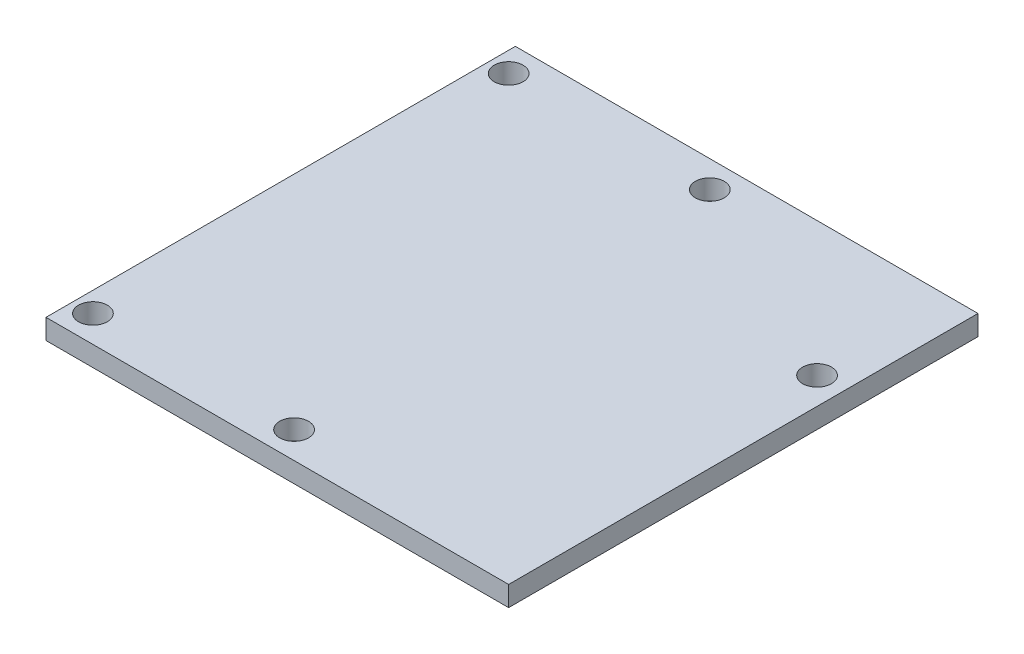
ISO-10303-21;
HEADER;
FILE_DESCRIPTION(('STEP AP214'),'2;1');
FILE_NAME('part.step','',(''),(''),'','','');
FILE_SCHEMA(('AUTOMOTIVE_DESIGN { 1 0 10303 214 1 1 1 1 }'));
ENDSEC;
DATA;
#1=APPLICATION_CONTEXT('core data for automotive mechanical design processes');
#2=APPLICATION_PROTOCOL_DEFINITION('international standard','automotive_design',2000,#1);
#3=PRODUCT_CONTEXT('',#1,'mechanical');
#4=PRODUCT('Part','Part','',(#3));
#5=PRODUCT_RELATED_PRODUCT_CATEGORY('part','',(#4));
#6=PRODUCT_DEFINITION_FORMATION('','',#4);
#7=PRODUCT_DEFINITION_CONTEXT('part definition',#1,'design');
#8=PRODUCT_DEFINITION('design','',#6,#7);
#9=PRODUCT_DEFINITION_SHAPE('','',#8);
#10=(LENGTH_UNIT() NAMED_UNIT(*) SI_UNIT(.MILLI.,.METRE.));
#11=(NAMED_UNIT(*) PLANE_ANGLE_UNIT() SI_UNIT($,.RADIAN.));
#12=(NAMED_UNIT(*) SI_UNIT($,.STERADIAN.) SOLID_ANGLE_UNIT());
#13=UNCERTAINTY_MEASURE_WITH_UNIT(LENGTH_MEASURE(1.E-05),#10,'distance_accuracy_value','');
#14=(GEOMETRIC_REPRESENTATION_CONTEXT(3) GLOBAL_UNCERTAINTY_ASSIGNED_CONTEXT((#13)) GLOBAL_UNIT_ASSIGNED_CONTEXT((#10,
#11,#12)) REPRESENTATION_CONTEXT('',''));
#15=CARTESIAN_POINT('',(0.,0.,0.));
#16=DIRECTION('',(0.,0.,1.));
#17=DIRECTION('',(1.,0.,0.));
#18=AXIS2_PLACEMENT_3D('',#15,#16,#17);
#19=CARTESIAN_POINT('',(0.,3.,0.));
#20=DIRECTION('',(0.,-1.,0.));
#21=DIRECTION('',(0.,0.,-1.));
#22=AXIS2_PLACEMENT_3D('',#19,#20,#21);
#23=PLANE('',#22);
#24=DIRECTION('',(-1.,0.,0.));
#25=VECTOR('',#24,1.);
#26=CARTESIAN_POINT('',(-18.,3.,-35.));
#27=LINE('',#26,#25);
#28=CARTESIAN_POINT('',(51.,3.,-35.));
#29=VERTEX_POINT('',#28);
#30=CARTESIAN_POINT('',(-18.,3.,-35.));
#31=VERTEX_POINT('',#30);
#32=EDGE_CURVE('E57',#29,#31,#27,.T.);
#33=ORIENTED_EDGE('',*,*,#32,.T.);
#34=DIRECTION('',(0.,0.,1.));
#35=VECTOR('',#34,1.);
#36=CARTESIAN_POINT('',(-18.,3.,35.));
#37=LINE('',#36,#35);
#38=CARTESIAN_POINT('',(-18.,3.,35.));
#39=VERTEX_POINT('',#38);
#40=EDGE_CURVE('E87',#31,#39,#37,.T.);
#41=ORIENTED_EDGE('',*,*,#40,.T.);
#42=DIRECTION('',(1.,0.,0.));
#43=VECTOR('',#42,1.);
#44=CARTESIAN_POINT('',(-18.,3.,35.));
#45=LINE('',#44,#43);
#46=CARTESIAN_POINT('',(51.,3.,35.));
#47=VERTEX_POINT('',#46);
#48=EDGE_CURVE('E91',#39,#47,#45,.T.);
#49=ORIENTED_EDGE('',*,*,#48,.T.);
#50=DIRECTION('',(0.,0.,-1.));
#51=VECTOR('',#50,1.);
#52=CARTESIAN_POINT('',(51.,3.,-35.));
#53=LINE('',#52,#51);
#54=EDGE_CURVE('E102',#47,#29,#53,.T.);
#55=ORIENTED_EDGE('',*,*,#54,.T.);
#56=EDGE_LOOP('',(#33,#41,#49,#55));
#57=FACE_BOUND('',#56,.T.);
#58=CARTESIAN_POINT('',(15.,3.,-31.));
#59=DIRECTION('',(0.,1.,0.));
#60=DIRECTION('',(0.,0.,1.));
#61=AXIS2_PLACEMENT_3D('',#58,#59,#60);
#62=CIRCLE('',#61,2.15);
#63=CARTESIAN_POINT('',(15.,3.,-28.85));
#64=VERTEX_POINT('',#63);
#65=EDGE_CURVE('E111',#64,#64,#62,.T.);
#66=ORIENTED_EDGE('',*,*,#65,.F.);
#67=EDGE_LOOP('',(#66));
#68=FACE_BOUND('',#67,.T.);
#69=CARTESIAN_POINT('',(-15.,3.,-31.));
#70=DIRECTION('',(0.,1.,0.));
#71=DIRECTION('',(0.,0.,1.));
#72=AXIS2_PLACEMENT_3D('',#69,#70,#71);
#73=CIRCLE('',#72,2.15);
#74=CARTESIAN_POINT('',(-15.,3.,-28.85));
#75=VERTEX_POINT('',#74);
#76=EDGE_CURVE('E193',#75,#75,#73,.T.);
#77=ORIENTED_EDGE('',*,*,#76,.F.);
#78=EDGE_LOOP('',(#77));
#79=FACE_BOUND('',#78,.T.);
#80=CARTESIAN_POINT('',(-15.,3.,31.));
#81=DIRECTION('',(0.,1.,0.));
#82=DIRECTION('',(0.,0.,1.));
#83=AXIS2_PLACEMENT_3D('',#80,#81,#82);
#84=CIRCLE('',#83,2.15);
#85=CARTESIAN_POINT('',(-15.,3.,33.15));
#86=VERTEX_POINT('',#85);
#87=EDGE_CURVE('E185',#86,#86,#84,.T.);
#88=ORIENTED_EDGE('',*,*,#87,.F.);
#89=EDGE_LOOP('',(#88));
#90=FACE_BOUND('',#89,.T.);
#91=CARTESIAN_POINT('',(15.,3.,31.));
#92=DIRECTION('',(0.,1.,0.));
#93=DIRECTION('',(0.,0.,1.));
#94=AXIS2_PLACEMENT_3D('',#91,#92,#93);
#95=CIRCLE('',#94,2.15);
#96=CARTESIAN_POINT('',(15.,3.,33.15));
#97=VERTEX_POINT('',#96);
#98=EDGE_CURVE('E177',#97,#97,#95,.T.);
#99=ORIENTED_EDGE('',*,*,#98,.F.);
#100=EDGE_LOOP('',(#99));
#101=FACE_BOUND('',#100,.T.);
#102=CARTESIAN_POINT('',(47.,3.,-15.));
#103=DIRECTION('',(0.,1.,0.));
#104=DIRECTION('',(0.,0.,1.));
#105=AXIS2_PLACEMENT_3D('',#102,#103,#104);
#106=CIRCLE('',#105,2.15);
#107=CARTESIAN_POINT('',(47.,3.,-12.85));
#108=VERTEX_POINT('',#107);
#109=EDGE_CURVE('E166',#108,#108,#106,.T.);
#110=ORIENTED_EDGE('',*,*,#109,.F.);
#111=EDGE_LOOP('',(#110));
#112=FACE_BOUND('',#111,.T.);
#113=ADVANCED_FACE('F39',(#57,#68,#79,#90,#101,#112),#23,.F.);
#114=CARTESIAN_POINT('',(0.,0.,0.));
#115=DIRECTION('',(0.,-1.,0.));
#116=DIRECTION('',(0.,0.,-1.));
#117=AXIS2_PLACEMENT_3D('',#114,#115,#116);
#118=PLANE('',#117);
#119=CARTESIAN_POINT('',(15.,0.,31.));
#120=DIRECTION('',(0.,1.,0.));
#121=DIRECTION('',(0.,0.,1.));
#122=AXIS2_PLACEMENT_3D('',#119,#120,#121);
#123=CIRCLE('',#122,2.15);
#124=CARTESIAN_POINT('',(15.,0.,33.15));
#125=VERTEX_POINT('',#124);
#126=EDGE_CURVE('E174',#125,#125,#123,.T.);
#127=ORIENTED_EDGE('',*,*,#126,.T.);
#128=EDGE_LOOP('',(#127));
#129=FACE_BOUND('',#128,.T.);
#130=CARTESIAN_POINT('',(-15.,0.,-31.));
#131=DIRECTION('',(0.,1.,0.));
#132=DIRECTION('',(0.,0.,1.));
#133=AXIS2_PLACEMENT_3D('',#130,#131,#132);
#134=CIRCLE('',#133,2.15);
#135=CARTESIAN_POINT('',(-15.,0.,-28.85));
#136=VERTEX_POINT('',#135);
#137=EDGE_CURVE('E189',#136,#136,#134,.T.);
#138=ORIENTED_EDGE('',*,*,#137,.T.);
#139=EDGE_LOOP('',(#138));
#140=FACE_BOUND('',#139,.T.);
#141=DIRECTION('',(0.,0.,1.));
#142=VECTOR('',#141,1.);
#143=CARTESIAN_POINT('',(-18.,0.,35.));
#144=LINE('',#143,#142);
#145=CARTESIAN_POINT('',(-18.,0.,-35.));
#146=VERTEX_POINT('',#145);
#147=CARTESIAN_POINT('',(-18.,0.,35.));
#148=VERTEX_POINT('',#147);
#149=EDGE_CURVE('E96',#146,#148,#144,.T.);
#150=ORIENTED_EDGE('',*,*,#149,.F.);
#151=DIRECTION('',(-1.,0.,0.));
#152=VECTOR('',#151,1.);
#153=CARTESIAN_POINT('',(18.,0.,-35.));
#154=LINE('',#153,#152);
#155=CARTESIAN_POINT('',(51.,0.,-35.));
#156=VERTEX_POINT('',#155);
#157=EDGE_CURVE('E116',#156,#146,#154,.T.);
#158=ORIENTED_EDGE('',*,*,#157,.F.);
#159=DIRECTION('',(0.,0.,-1.));
#160=VECTOR('',#159,1.);
#161=CARTESIAN_POINT('',(51.,0.,-35.));
#162=LINE('',#161,#160);
#163=CARTESIAN_POINT('',(51.,0.,35.));
#164=VERTEX_POINT('',#163);
#165=EDGE_CURVE('E81',#164,#156,#162,.T.);
#166=ORIENTED_EDGE('',*,*,#165,.F.);
#167=DIRECTION('',(1.,0.,0.));
#168=VECTOR('',#167,1.);
#169=CARTESIAN_POINT('',(51.,0.,35.));
#170=LINE('',#169,#168);
#171=EDGE_CURVE('E74',#148,#164,#170,.T.);
#172=ORIENTED_EDGE('',*,*,#171,.F.);
#173=EDGE_LOOP('',(#150,#158,#166,#172));
#174=FACE_BOUND('',#173,.T.);
#175=CARTESIAN_POINT('',(15.,0.,-31.));
#176=DIRECTION('',(0.,1.,0.));
#177=DIRECTION('',(0.,0.,1.));
#178=AXIS2_PLACEMENT_3D('',#175,#176,#177);
#179=CIRCLE('',#178,2.15);
#180=CARTESIAN_POINT('',(15.,0.,-28.85));
#181=VERTEX_POINT('',#180);
#182=EDGE_CURVE('E197',#181,#181,#179,.T.);
#183=ORIENTED_EDGE('',*,*,#182,.T.);
#184=EDGE_LOOP('',(#183));
#185=FACE_BOUND('',#184,.T.);
#186=CARTESIAN_POINT('',(-15.,0.,31.));
#187=DIRECTION('',(0.,1.,0.));
#188=DIRECTION('',(0.,0.,1.));
#189=AXIS2_PLACEMENT_3D('',#186,#187,#188);
#190=CIRCLE('',#189,2.15);
#191=CARTESIAN_POINT('',(-15.,0.,33.15));
#192=VERTEX_POINT('',#191);
#193=EDGE_CURVE('E181',#192,#192,#190,.T.);
#194=ORIENTED_EDGE('',*,*,#193,.T.);
#195=EDGE_LOOP('',(#194));
#196=FACE_BOUND('',#195,.T.);
#197=CARTESIAN_POINT('',(47.,0.,-15.));
#198=DIRECTION('',(0.,1.,0.));
#199=DIRECTION('',(0.,0.,1.));
#200=AXIS2_PLACEMENT_3D('',#197,#198,#199);
#201=CIRCLE('',#200,2.15);
#202=CARTESIAN_POINT('',(47.,0.,-12.85));
#203=VERTEX_POINT('',#202);
#204=EDGE_CURVE('E169',#203,#203,#201,.T.);
#205=ORIENTED_EDGE('',*,*,#204,.T.);
#206=EDGE_LOOP('',(#205));
#207=FACE_BOUND('',#206,.T.);
#208=ADVANCED_FACE('F125',(#129,#140,#174,#185,#196,#207),#118,.T.);
#209=CARTESIAN_POINT('',(-18.,3.,35.));
#210=DIRECTION('',(1.,0.,0.));
#211=DIRECTION('',(0.,0.,-1.));
#212=AXIS2_PLACEMENT_3D('',#209,#210,#211);
#213=PLANE('',#212);
#214=ORIENTED_EDGE('',*,*,#149,.T.);
#215=DIRECTION('',(0.,-1.,0.));
#216=VECTOR('',#215,1.);
#217=CARTESIAN_POINT('',(-18.,3.,35.));
#218=LINE('',#217,#216);
#219=EDGE_CURVE('E49',#39,#148,#218,.T.);
#220=ORIENTED_EDGE('',*,*,#219,.F.);
#221=ORIENTED_EDGE('',*,*,#40,.F.);
#222=DIRECTION('',(0.,-1.,0.));
#223=VECTOR('',#222,1.);
#224=CARTESIAN_POINT('',(-18.,3.,-35.));
#225=LINE('',#224,#223);
#226=EDGE_CURVE('E11',#31,#146,#225,.T.);
#227=ORIENTED_EDGE('',*,*,#226,.T.);
#228=EDGE_LOOP('',(#214,#220,#221,#227));
#229=FACE_BOUND('',#228,.T.);
#230=ADVANCED_FACE('F41',(#229),#213,.F.);
#231=CARTESIAN_POINT('',(51.,3.,35.));
#232=DIRECTION('',(0.,0.,-1.));
#233=DIRECTION('',(-1.,0.,0.));
#234=AXIS2_PLACEMENT_3D('',#231,#232,#233);
#235=PLANE('',#234);
#236=ORIENTED_EDGE('',*,*,#171,.T.);
#237=DIRECTION('',(0.,-1.,0.));
#238=VECTOR('',#237,1.);
#239=CARTESIAN_POINT('',(51.,3.,35.));
#240=LINE('',#239,#238);
#241=EDGE_CURVE('E98',#47,#164,#240,.T.);
#242=ORIENTED_EDGE('',*,*,#241,.F.);
#243=ORIENTED_EDGE('',*,*,#48,.F.);
#244=ORIENTED_EDGE('',*,*,#219,.T.);
#245=EDGE_LOOP('',(#236,#242,#243,#244));
#246=FACE_BOUND('',#245,.T.);
#247=ADVANCED_FACE('F99',(#246),#235,.F.);
#248=CARTESIAN_POINT('',(51.,3.,-35.));
#249=DIRECTION('',(-1.,0.,0.));
#250=DIRECTION('',(0.,0.,1.));
#251=AXIS2_PLACEMENT_3D('',#248,#249,#250);
#252=PLANE('',#251);
#253=ORIENTED_EDGE('',*,*,#165,.T.);
#254=DIRECTION('',(0.,-1.,0.));
#255=VECTOR('',#254,1.);
#256=CARTESIAN_POINT('',(51.,3.,-35.));
#257=LINE('',#256,#255);
#258=EDGE_CURVE('E105',#29,#156,#257,.T.);
#259=ORIENTED_EDGE('',*,*,#258,.F.);
#260=ORIENTED_EDGE('',*,*,#54,.F.);
#261=ORIENTED_EDGE('',*,*,#241,.T.);
#262=EDGE_LOOP('',(#253,#259,#260,#261));
#263=FACE_BOUND('',#262,.T.);
#264=ADVANCED_FACE('F122',(#263),#252,.F.);
#265=CARTESIAN_POINT('',(18.,3.,-35.));
#266=DIRECTION('',(0.,0.,1.));
#267=DIRECTION('',(1.,0.,0.));
#268=AXIS2_PLACEMENT_3D('',#265,#266,#267);
#269=PLANE('',#268);
#270=ORIENTED_EDGE('',*,*,#157,.T.);
#271=ORIENTED_EDGE('',*,*,#226,.F.);
#272=ORIENTED_EDGE('',*,*,#32,.F.);
#273=ORIENTED_EDGE('',*,*,#258,.T.);
#274=EDGE_LOOP('',(#270,#271,#272,#273));
#275=FACE_BOUND('',#274,.T.);
#276=ADVANCED_FACE('F127',(#275),#269,.F.);
#277=CARTESIAN_POINT('',(15.,3.,-31.));
#278=DIRECTION('',(0.,-1.,0.));
#279=DIRECTION('',(0.,0.,-1.));
#280=AXIS2_PLACEMENT_3D('',#277,#278,#279);
#281=CYLINDRICAL_SURFACE('',#280,2.15);
#282=ORIENTED_EDGE('',*,*,#65,.T.);
#283=EDGE_LOOP('',(#282));
#284=FACE_BOUND('',#283,.T.);
#285=ORIENTED_EDGE('',*,*,#182,.F.);
#286=EDGE_LOOP('',(#285));
#287=FACE_BOUND('',#286,.T.);
#288=ADVANCED_FACE('F129',(#284,#287),#281,.F.);
#289=CARTESIAN_POINT('',(-15.,3.,-31.));
#290=DIRECTION('',(0.,-1.,0.));
#291=DIRECTION('',(0.,0.,-1.));
#292=AXIS2_PLACEMENT_3D('',#289,#290,#291);
#293=CYLINDRICAL_SURFACE('',#292,2.15);
#294=ORIENTED_EDGE('',*,*,#76,.T.);
#295=EDGE_LOOP('',(#294));
#296=FACE_BOUND('',#295,.T.);
#297=ORIENTED_EDGE('',*,*,#137,.F.);
#298=EDGE_LOOP('',(#297));
#299=FACE_BOUND('',#298,.T.);
#300=ADVANCED_FACE('F135',(#296,#299),#293,.F.);
#301=CARTESIAN_POINT('',(-15.,3.,31.));
#302=DIRECTION('',(0.,-1.,0.));
#303=DIRECTION('',(0.,0.,-1.));
#304=AXIS2_PLACEMENT_3D('',#301,#302,#303);
#305=CYLINDRICAL_SURFACE('',#304,2.15);
#306=ORIENTED_EDGE('',*,*,#87,.T.);
#307=EDGE_LOOP('',(#306));
#308=FACE_BOUND('',#307,.T.);
#309=ORIENTED_EDGE('',*,*,#193,.F.);
#310=EDGE_LOOP('',(#309));
#311=FACE_BOUND('',#310,.T.);
#312=ADVANCED_FACE('F149',(#308,#311),#305,.F.);
#313=CARTESIAN_POINT('',(15.,3.,31.));
#314=DIRECTION('',(0.,-1.,0.));
#315=DIRECTION('',(0.,0.,-1.));
#316=AXIS2_PLACEMENT_3D('',#313,#314,#315);
#317=CYLINDRICAL_SURFACE('',#316,2.15);
#318=ORIENTED_EDGE('',*,*,#98,.T.);
#319=EDGE_LOOP('',(#318));
#320=FACE_BOUND('',#319,.T.);
#321=ORIENTED_EDGE('',*,*,#126,.F.);
#322=EDGE_LOOP('',(#321));
#323=FACE_BOUND('',#322,.T.);
#324=ADVANCED_FACE('F153',(#320,#323),#317,.F.);
#325=CARTESIAN_POINT('',(47.,3.,-15.));
#326=DIRECTION('',(0.,-1.,0.));
#327=DIRECTION('',(0.,0.,-1.));
#328=AXIS2_PLACEMENT_3D('',#325,#326,#327);
#329=CYLINDRICAL_SURFACE('',#328,2.15);
#330=ORIENTED_EDGE('',*,*,#109,.T.);
#331=EDGE_LOOP('',(#330));
#332=FACE_BOUND('',#331,.T.);
#333=ORIENTED_EDGE('',*,*,#204,.F.);
#334=EDGE_LOOP('',(#333));
#335=FACE_BOUND('',#334,.T.);
#336=ADVANCED_FACE('F157',(#332,#335),#329,.F.);
#337=CLOSED_SHELL('',(#113,#208,#230,#247,#264,#276,#288,#300,#312,#324,#336));
#338=MANIFOLD_SOLID_BREP('B2',#337);
#339=ADVANCED_BREP_SHAPE_REPRESENTATION('',(#18,#338),#14);
#340=SHAPE_DEFINITION_REPRESENTATION(#9,#339);
ENDSEC;
END-ISO-10303-21;
